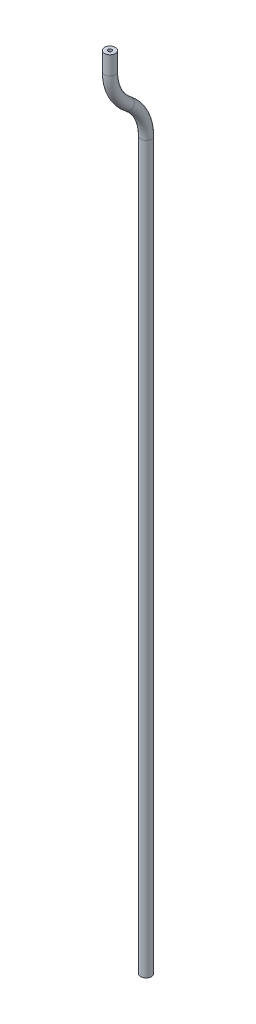
ISO-10303-21;
HEADER;
FILE_DESCRIPTION(('STEP AP214'),'2;1');
FILE_NAME('part.step','',(''),(''),'','','');
FILE_SCHEMA(('AUTOMOTIVE_DESIGN { 1 0 10303 214 1 1 1 1 }'));
ENDSEC;
DATA;
#1=APPLICATION_CONTEXT('core data for automotive mechanical design processes');
#2=APPLICATION_PROTOCOL_DEFINITION('international standard','automotive_design',2000,#1);
#3=PRODUCT_CONTEXT('',#1,'mechanical');
#4=PRODUCT('Part','Part','',(#3));
#5=PRODUCT_RELATED_PRODUCT_CATEGORY('part','',(#4));
#6=PRODUCT_DEFINITION_FORMATION('','',#4);
#7=PRODUCT_DEFINITION_CONTEXT('part definition',#1,'design');
#8=PRODUCT_DEFINITION('design','',#6,#7);
#9=PRODUCT_DEFINITION_SHAPE('','',#8);
#10=(LENGTH_UNIT() NAMED_UNIT(*) SI_UNIT(.MILLI.,.METRE.));
#11=(NAMED_UNIT(*) PLANE_ANGLE_UNIT() SI_UNIT($,.RADIAN.));
#12=(NAMED_UNIT(*) SI_UNIT($,.STERADIAN.) SOLID_ANGLE_UNIT());
#13=UNCERTAINTY_MEASURE_WITH_UNIT(LENGTH_MEASURE(1.E-05),#10,'distance_accuracy_value','');
#14=(GEOMETRIC_REPRESENTATION_CONTEXT(3) GLOBAL_UNCERTAINTY_ASSIGNED_CONTEXT((#13)) GLOBAL_UNIT_ASSIGNED_CONTEXT((#10,
#11,#12)) REPRESENTATION_CONTEXT('',''));
#15=CARTESIAN_POINT('',(0.,0.,0.));
#16=DIRECTION('',(0.,0.,1.));
#17=DIRECTION('',(1.,0.,0.));
#18=AXIS2_PLACEMENT_3D('',#15,#16,#17);
#19=CARTESIAN_POINT('',(0.,0.,16.25));
#20=DIRECTION('',(0.,-1.,0.));
#21=DIRECTION('',(0.,0.,-1.));
#22=AXIS2_PLACEMENT_3D('',#19,#20,#21);
#23=CYLINDRICAL_SURFACE('',#22,1.75);
#24=CARTESIAN_POINT('',(0.,-6.,16.25));
#25=DIRECTION('',(0.,1.,0.));
#26=DIRECTION('',(0.,0.,1.));
#27=AXIS2_PLACEMENT_3D('',#24,#25,#26);
#28=CIRCLE('',#27,1.75);
#29=CARTESIAN_POINT('',(0.,-6.,18.));
#30=VERTEX_POINT('',#29);
#31=EDGE_CURVE('E59',#30,#30,#28,.T.);
#32=ORIENTED_EDGE('',*,*,#31,.T.);
#33=EDGE_LOOP('',(#32));
#34=FACE_BOUND('',#33,.T.);
#35=CARTESIAN_POINT('',(0.,0.,16.25));
#36=DIRECTION('',(0.,1.,0.));
#37=DIRECTION('',(0.,0.,1.));
#38=AXIS2_PLACEMENT_3D('',#35,#36,#37);
#39=CIRCLE('',#38,1.75);
#40=CARTESIAN_POINT('',(0.,0.,18.));
#41=VERTEX_POINT('',#40);
#42=EDGE_CURVE('E56',#41,#41,#39,.T.);
#43=ORIENTED_EDGE('',*,*,#42,.F.);
#44=EDGE_LOOP('',(#43));
#45=FACE_BOUND('',#44,.T.);
#46=ADVANCED_FACE('F35',(#34,#45),#23,.T.);
#47=CARTESIAN_POINT('',(0.,-6.,1.05718085106383));
#48=DIRECTION('',(1.,0.,0.));
#49=DIRECTION('',(0.,0.,-1.));
#50=AXIS2_PLACEMENT_3D('',#47,#48,#49);
#51=TOROIDAL_SURFACE('',#50,15.1928191489362,1.75);
#52=CARTESIAN_POINT('',(0.,-18.,10.375));
#53=DIRECTION('',(0.,0.613304157549235,0.789846827133479));
#54=DIRECTION('',(0.,-0.789846827133479,0.613304157549235));
#55=AXIS2_PLACEMENT_3D('',#52,#53,#54);
#56=CIRCLE('',#55,1.75);
#57=CARTESIAN_POINT('',(0.,-19.3822319474836,11.4482822757112));
#58=VERTEX_POINT('',#57);
#59=EDGE_CURVE('E61',#58,#58,#56,.T.);
#60=CARTESIAN_POINT('',(0.,-6.,1.05718085106383));
#61=DIRECTION('',(1.,0.,0.));
#62=DIRECTION('',(0.,0.,-1.));
#63=AXIS2_PLACEMENT_3D('',#60,#61,#62);
#64=CIRCLE('',#63,16.9428191489362);
#65=EDGE_CURVE('',#30,#58,#64,.T.);
#66=ORIENTED_EDGE('',*,*,#31,.F.);
#67=ORIENTED_EDGE('',*,*,#59,.T.);
#68=ORIENTED_EDGE('',*,*,#65,.T.);
#69=ORIENTED_EDGE('',*,*,#65,.F.);
#70=EDGE_LOOP('',(#66,#68,#67,#69));
#71=FACE_BOUND('',#70,.T.);
#72=ADVANCED_FACE('F81',(#71),#51,.T.);
#73=CARTESIAN_POINT('',(0.,-30.,19.6928191489362));
#74=DIRECTION('',(-1.,0.,0.));
#75=DIRECTION('',(0.,0.,1.));
#76=AXIS2_PLACEMENT_3D('',#73,#74,#75);
#77=TOROIDAL_SURFACE('',#76,15.1928191489362,1.75);
#78=CARTESIAN_POINT('',(0.,-30.,4.5));
#79=DIRECTION('',(0.,1.,0.));
#80=DIRECTION('',(0.,0.,1.));
#81=AXIS2_PLACEMENT_3D('',#78,#79,#80);
#82=CIRCLE('',#81,1.75);
#83=CARTESIAN_POINT('',(0.,-30.,6.25));
#84=VERTEX_POINT('',#83);
#85=EDGE_CURVE('E39',#84,#84,#82,.T.);
#86=ORIENTED_EDGE('',*,*,#85,.T.);
#87=EDGE_LOOP('',(#86));
#88=FACE_BOUND('',#87,.T.);
#89=ORIENTED_EDGE('',*,*,#59,.F.);
#90=EDGE_LOOP('',(#89));
#91=FACE_BOUND('',#90,.T.);
#92=ADVANCED_FACE('F68',(#88,#91),#77,.T.);
#93=CARTESIAN_POINT('',(0.,-30.,4.5));
#94=DIRECTION('',(0.,-1.,0.));
#95=DIRECTION('',(0.,0.,-1.));
#96=AXIS2_PLACEMENT_3D('',#93,#94,#95);
#97=CYLINDRICAL_SURFACE('',#96,1.75);
#98=CARTESIAN_POINT('',(0.,-266.,4.5));
#99=DIRECTION('',(0.,1.,0.));
#100=DIRECTION('',(0.,0.,1.));
#101=AXIS2_PLACEMENT_3D('',#98,#99,#100);
#102=CIRCLE('',#101,1.75);
#103=CARTESIAN_POINT('',(0.,-266.,6.25));
#104=VERTEX_POINT('',#103);
#105=EDGE_CURVE('E52',#104,#104,#102,.T.);
#106=ORIENTED_EDGE('',*,*,#105,.T.);
#107=EDGE_LOOP('',(#106));
#108=FACE_BOUND('',#107,.T.);
#109=ORIENTED_EDGE('',*,*,#85,.F.);
#110=EDGE_LOOP('',(#109));
#111=FACE_BOUND('',#110,.T.);
#112=ADVANCED_FACE('F37',(#108,#111),#97,.T.);
#113=CARTESIAN_POINT('',(0.,0.,16.25));
#114=DIRECTION('',(0.,1.,0.));
#115=DIRECTION('',(0.,0.,1.));
#116=AXIS2_PLACEMENT_3D('',#113,#114,#115);
#117=PLANE('',#116);
#118=CARTESIAN_POINT('',(0.,0.,16.25));
#119=DIRECTION('',(0.,1.,0.));
#120=DIRECTION('',(0.,0.,1.));
#121=AXIS2_PLACEMENT_3D('',#118,#119,#120);
#122=CIRCLE('',#121,0.6);
#123=CARTESIAN_POINT('',(0.,0.,16.85));
#124=VERTEX_POINT('',#123);
#125=EDGE_CURVE('E55',#124,#124,#122,.F.);
#126=ORIENTED_EDGE('',*,*,#125,.T.);
#127=EDGE_LOOP('',(#126));
#128=FACE_BOUND('',#127,.T.);
#129=ORIENTED_EDGE('',*,*,#42,.T.);
#130=EDGE_LOOP('',(#129));
#131=FACE_BOUND('',#130,.T.);
#132=ADVANCED_FACE('F72',(#128,#131),#117,.T.);
#133=CARTESIAN_POINT('',(0.,-266.,4.5));
#134=DIRECTION('',(0.,1.,0.));
#135=DIRECTION('',(0.,0.,1.));
#136=AXIS2_PLACEMENT_3D('',#133,#134,#135);
#137=PLANE('',#136);
#138=CARTESIAN_POINT('',(0.,-266.,4.5));
#139=DIRECTION('',(0.,1.,0.));
#140=DIRECTION('',(0.,0.,1.));
#141=AXIS2_PLACEMENT_3D('',#138,#139,#140);
#142=CIRCLE('',#141,0.6);
#143=CARTESIAN_POINT('',(0.,-266.,5.1));
#144=VERTEX_POINT('',#143);
#145=EDGE_CURVE('E10',#144,#144,#142,.F.);
#146=ORIENTED_EDGE('',*,*,#145,.F.);
#147=EDGE_LOOP('',(#146));
#148=FACE_BOUND('',#147,.T.);
#149=ORIENTED_EDGE('',*,*,#105,.F.);
#150=EDGE_LOOP('',(#149));
#151=FACE_BOUND('',#150,.T.);
#152=ADVANCED_FACE('F78',(#148,#151),#137,.F.);
#153=CARTESIAN_POINT('',(0.,0.,16.25));
#154=DIRECTION('',(0.,-1.,0.));
#155=DIRECTION('',(0.,0.,-1.));
#156=AXIS2_PLACEMENT_3D('',#153,#154,#155);
#157=CYLINDRICAL_SURFACE('',#156,0.6);
#158=CARTESIAN_POINT('',(0.,-6.,16.25));
#159=DIRECTION('',(0.,1.,0.));
#160=DIRECTION('',(0.,0.,1.));
#161=AXIS2_PLACEMENT_3D('',#158,#159,#160);
#162=CIRCLE('',#161,0.6);
#163=CARTESIAN_POINT('',(0.,-6.,16.85));
#164=VERTEX_POINT('',#163);
#165=EDGE_CURVE('E168',#164,#164,#162,.F.);
#166=ORIENTED_EDGE('',*,*,#165,.T.);
#167=EDGE_LOOP('',(#166));
#168=FACE_BOUND('',#167,.T.);
#169=ORIENTED_EDGE('',*,*,#125,.F.);
#170=EDGE_LOOP('',(#169));
#171=FACE_BOUND('',#170,.T.);
#172=ADVANCED_FACE('F96',(#168,#171),#157,.F.);
#173=CARTESIAN_POINT('',(0.,-6.,1.05718085106383));
#174=DIRECTION('',(1.,0.,0.));
#175=DIRECTION('',(0.,0.,-1.));
#176=AXIS2_PLACEMENT_3D('',#173,#174,#175);
#177=TOROIDAL_SURFACE('',#176,15.1928191489362,0.6);
#178=CARTESIAN_POINT('',(0.,-18.,10.375));
#179=DIRECTION('',(0.,0.613304157549235,0.789846827133479));
#180=DIRECTION('',(0.,-0.789846827133479,0.613304157549235));
#181=AXIS2_PLACEMENT_3D('',#178,#179,#180);
#182=CIRCLE('',#181,0.6);
#183=CARTESIAN_POINT('',(0.,-18.4739080962801,10.7429824945295));
#184=VERTEX_POINT('',#183);
#185=EDGE_CURVE('E48',#184,#184,#182,.F.);
#186=CARTESIAN_POINT('',(0.,-6.,1.05718085106383));
#187=DIRECTION('',(1.,0.,0.));
#188=DIRECTION('',(0.,0.,-1.));
#189=AXIS2_PLACEMENT_3D('',#186,#187,#188);
#190=CIRCLE('',#189,15.7928191489362);
#191=EDGE_CURVE('',#164,#184,#190,.T.);
#192=ORIENTED_EDGE('',*,*,#165,.F.);
#193=ORIENTED_EDGE('',*,*,#185,.T.);
#194=ORIENTED_EDGE('',*,*,#191,.T.);
#195=ORIENTED_EDGE('',*,*,#191,.F.);
#196=EDGE_LOOP('',(#192,#194,#193,#195));
#197=FACE_BOUND('',#196,.T.);
#198=ADVANCED_FACE('F89',(#197),#177,.F.);
#199=CARTESIAN_POINT('',(0.,-30.,19.6928191489362));
#200=DIRECTION('',(-1.,0.,0.));
#201=DIRECTION('',(0.,0.,1.));
#202=AXIS2_PLACEMENT_3D('',#199,#200,#201);
#203=TOROIDAL_SURFACE('',#202,15.1928191489362,0.6);
#204=CARTESIAN_POINT('',(0.,-30.,4.5));
#205=DIRECTION('',(0.,1.,0.));
#206=DIRECTION('',(0.,0.,1.));
#207=AXIS2_PLACEMENT_3D('',#204,#205,#206);
#208=CIRCLE('',#207,0.6);
#209=CARTESIAN_POINT('',(0.,-30.,5.1));
#210=VERTEX_POINT('',#209);
#211=EDGE_CURVE('E43',#210,#210,#208,.F.);
#212=ORIENTED_EDGE('',*,*,#211,.T.);
#213=EDGE_LOOP('',(#212));
#214=FACE_BOUND('',#213,.T.);
#215=ORIENTED_EDGE('',*,*,#185,.F.);
#216=EDGE_LOOP('',(#215));
#217=FACE_BOUND('',#216,.T.);
#218=ADVANCED_FACE('F84',(#214,#217),#203,.F.);
#219=CARTESIAN_POINT('',(0.,-30.,4.5));
#220=DIRECTION('',(0.,-1.,0.));
#221=DIRECTION('',(0.,0.,-1.));
#222=AXIS2_PLACEMENT_3D('',#219,#220,#221);
#223=CYLINDRICAL_SURFACE('',#222,0.6);
#224=ORIENTED_EDGE('',*,*,#145,.T.);
#225=EDGE_LOOP('',(#224));
#226=FACE_BOUND('',#225,.T.);
#227=ORIENTED_EDGE('',*,*,#211,.F.);
#228=EDGE_LOOP('',(#227));
#229=FACE_BOUND('',#228,.T.);
#230=ADVANCED_FACE('F82',(#226,#229),#223,.F.);
#231=CLOSED_SHELL('',(#46,#72,#92,#112,#132,#152,#172,#198,#218,#230));
#232=MANIFOLD_SOLID_BREP('B2',#231);
#233=ADVANCED_BREP_SHAPE_REPRESENTATION('',(#18,#232),#14);
#234=SHAPE_DEFINITION_REPRESENTATION(#9,#233);
ENDSEC;
END-ISO-10303-21;
